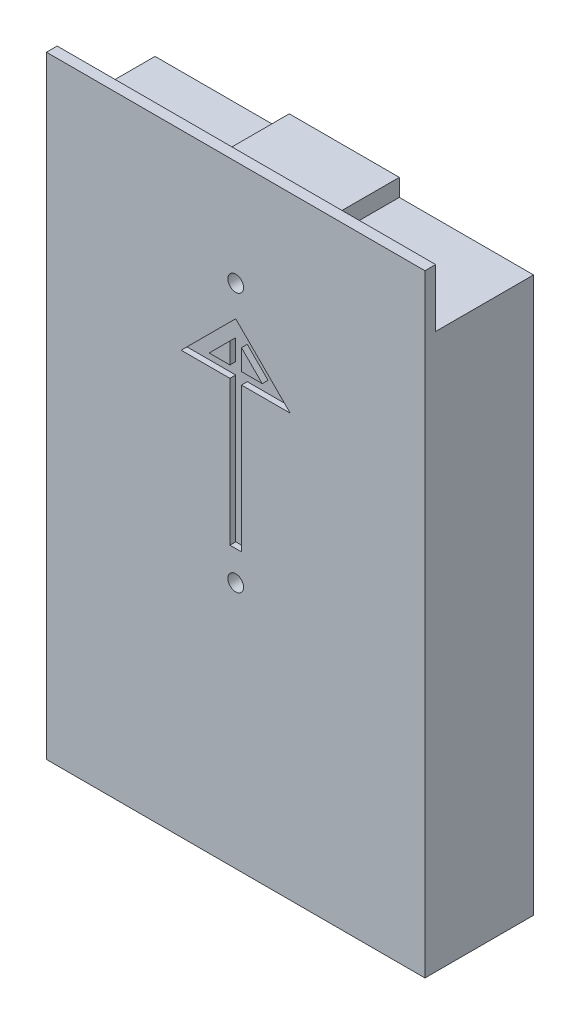
ISO-10303-21;
HEADER;
FILE_DESCRIPTION(('STEP AP214'),'2;1');
FILE_NAME('part.step','',(''),(''),'','','');
FILE_SCHEMA(('AUTOMOTIVE_DESIGN { 1 0 10303 214 1 1 1 1 }'));
ENDSEC;
DATA;
#1=APPLICATION_CONTEXT('core data for automotive mechanical design processes');
#2=APPLICATION_PROTOCOL_DEFINITION('international standard','automotive_design',2000,#1);
#3=PRODUCT_CONTEXT('',#1,'mechanical');
#4=PRODUCT('Part','Part','',(#3));
#5=PRODUCT_RELATED_PRODUCT_CATEGORY('part','',(#4));
#6=PRODUCT_DEFINITION_FORMATION('','',#4);
#7=PRODUCT_DEFINITION_CONTEXT('part definition',#1,'design');
#8=PRODUCT_DEFINITION('design','',#6,#7);
#9=PRODUCT_DEFINITION_SHAPE('','',#8);
#10=(LENGTH_UNIT() NAMED_UNIT(*) SI_UNIT(.MILLI.,.METRE.));
#11=(NAMED_UNIT(*) PLANE_ANGLE_UNIT() SI_UNIT($,.RADIAN.));
#12=(NAMED_UNIT(*) SI_UNIT($,.STERADIAN.) SOLID_ANGLE_UNIT());
#13=UNCERTAINTY_MEASURE_WITH_UNIT(LENGTH_MEASURE(1.E-05),#10,'distance_accuracy_value','');
#14=(GEOMETRIC_REPRESENTATION_CONTEXT(3) GLOBAL_UNCERTAINTY_ASSIGNED_CONTEXT((#13)) GLOBAL_UNIT_ASSIGNED_CONTEXT((#10,
#11,#12)) REPRESENTATION_CONTEXT('',''));
#15=CARTESIAN_POINT('',(0.,0.,0.));
#16=DIRECTION('',(0.,0.,1.));
#17=DIRECTION('',(1.,0.,0.));
#18=AXIS2_PLACEMENT_3D('',#15,#16,#17);
#19=CARTESIAN_POINT('',(-32.675,47.875,18.75));
#20=DIRECTION('',(0.,-1.,0.));
#21=DIRECTION('',(0.,0.,-1.));
#22=AXIS2_PLACEMENT_3D('',#19,#20,#21);
#23=PLANE('',#22);
#24=DIRECTION('',(-1.,0.,0.));
#25=VECTOR('',#24,1.);
#26=CARTESIAN_POINT('',(0.,47.875,16.9));
#27=LINE('',#26,#25);
#28=CARTESIAN_POINT('',(-9.49999999999997,47.875,16.9));
#29=VERTEX_POINT('',#28);
#30=CARTESIAN_POINT('',(-32.675,47.875,16.9));
#31=VERTEX_POINT('',#30);
#32=EDGE_CURVE('E212',#29,#31,#27,.T.);
#33=ORIENTED_EDGE('',*,*,#32,.F.);
#34=DIRECTION('',(0.,0.,1.));
#35=VECTOR('',#34,1.);
#36=CARTESIAN_POINT('',(-9.49999999999998,47.875,-19.2353840616713));
#37=LINE('',#36,#35);
#38=CARTESIAN_POINT('',(-9.49999999999998,47.875,0.));
#39=VERTEX_POINT('',#38);
#40=EDGE_CURVE('E256',#39,#29,#37,.T.);
#41=ORIENTED_EDGE('',*,*,#40,.F.);
#42=DIRECTION('',(-1.,0.,0.));
#43=VECTOR('',#42,1.);
#44=CARTESIAN_POINT('',(-32.675,47.875,0.));
#45=LINE('',#44,#43);
#46=CARTESIAN_POINT('',(-32.675,47.875,0.));
#47=VERTEX_POINT('',#46);
#48=EDGE_CURVE('E371',#39,#47,#45,.T.);
#49=ORIENTED_EDGE('',*,*,#48,.T.);
#50=DIRECTION('',(0.,0.,-1.));
#51=VECTOR('',#50,1.);
#52=CARTESIAN_POINT('',(-32.675,47.875,18.75));
#53=LINE('',#52,#51);
#54=EDGE_CURVE('E60',#31,#47,#53,.T.);
#55=ORIENTED_EDGE('',*,*,#54,.F.);
#56=EDGE_LOOP('',(#33,#41,#49,#55));
#57=FACE_BOUND('',#56,.T.);
#58=ADVANCED_FACE('F52',(#57),#23,.F.);
#59=DIRECTION('',(-1.,0.,0.));
#60=VECTOR('',#59,1.);
#61=CARTESIAN_POINT('',(0.,47.875,16.9));
#62=LINE('',#61,#60);
#63=CARTESIAN_POINT('',(32.675,47.875,16.9));
#64=VERTEX_POINT('',#63);
#65=CARTESIAN_POINT('',(9.50000000000002,47.875,16.9));
#66=VERTEX_POINT('',#65);
#67=EDGE_CURVE('E241',#64,#66,#62,.T.);
#68=ORIENTED_EDGE('',*,*,#67,.F.);
#69=DIRECTION('',(0.,0.,-1.));
#70=VECTOR('',#69,1.);
#71=CARTESIAN_POINT('',(32.675,47.875,18.75));
#72=LINE('',#71,#70);
#73=CARTESIAN_POINT('',(32.675,47.875,0.));
#74=VERTEX_POINT('',#73);
#75=EDGE_CURVE('E12',#64,#74,#72,.T.);
#76=ORIENTED_EDGE('',*,*,#75,.T.);
#77=CARTESIAN_POINT('',(9.50000000000002,47.875,0.));
#78=VERTEX_POINT('',#77);
#79=EDGE_CURVE('E372',#74,#78,#45,.T.);
#80=ORIENTED_EDGE('',*,*,#79,.T.);
#81=DIRECTION('',(0.,0.,1.));
#82=VECTOR('',#81,1.);
#83=CARTESIAN_POINT('',(9.50000000000002,47.875,-19.2353840616713));
#84=LINE('',#83,#82);
#85=EDGE_CURVE('E253',#78,#66,#84,.T.);
#86=ORIENTED_EDGE('',*,*,#85,.T.);
#87=EDGE_LOOP('',(#68,#76,#80,#86));
#88=FACE_BOUND('',#87,.T.);
#89=ADVANCED_FACE('F430',(#88),#23,.F.);
#90=CARTESIAN_POINT('',(-9.49999999999998,50.875,-19.2353840616713));
#91=DIRECTION('',(0.,1.,0.));
#92=DIRECTION('',(-1.,0.,0.));
#93=AXIS2_PLACEMENT_3D('',#90,#91,#92);
#94=PLANE('',#93);
#95=DIRECTION('',(0.,0.,1.));
#96=VECTOR('',#95,1.);
#97=CARTESIAN_POINT('',(-9.49999999999998,50.875,-19.2353840616713));
#98=LINE('',#97,#96);
#99=CARTESIAN_POINT('',(-9.49999999999998,50.875,0.));
#100=VERTEX_POINT('',#99);
#101=CARTESIAN_POINT('',(-9.49999999999998,50.875,16.9));
#102=VERTEX_POINT('',#101);
#103=EDGE_CURVE('E248',#100,#102,#98,.T.);
#104=ORIENTED_EDGE('',*,*,#103,.T.);
#105=DIRECTION('',(-1.,0.,0.));
#106=VECTOR('',#105,1.);
#107=CARTESIAN_POINT('',(0.,50.875,16.9));
#108=LINE('',#107,#106);
#109=CARTESIAN_POINT('',(9.50000000000002,50.875,16.9));
#110=VERTEX_POINT('',#109);
#111=EDGE_CURVE('E237',#110,#102,#108,.T.);
#112=ORIENTED_EDGE('',*,*,#111,.F.);
#113=DIRECTION('',(0.,0.,1.));
#114=VECTOR('',#113,1.);
#115=CARTESIAN_POINT('',(9.50000000000002,50.875,-19.2353840616713));
#116=LINE('',#115,#114);
#117=CARTESIAN_POINT('',(9.50000000000002,50.875,0.));
#118=VERTEX_POINT('',#117);
#119=EDGE_CURVE('E252',#118,#110,#116,.T.);
#120=ORIENTED_EDGE('',*,*,#119,.F.);
#121=DIRECTION('',(-1.,0.,0.));
#122=VECTOR('',#121,1.);
#123=CARTESIAN_POINT('',(-9.49999999999998,50.875,0.));
#124=LINE('',#123,#122);
#125=EDGE_CURVE('E244',#118,#100,#124,.T.);
#126=ORIENTED_EDGE('',*,*,#125,.T.);
#127=EDGE_LOOP('',(#104,#112,#120,#126));
#128=FACE_BOUND('',#127,.T.);
#129=ADVANCED_FACE('F434',(#128),#94,.T.);
#130=CARTESIAN_POINT('',(-9.49999999999998,50.875,-19.2353840616713));
#131=DIRECTION('',(-1.,0.,0.));
#132=DIRECTION('',(0.,-1.,0.));
#133=AXIS2_PLACEMENT_3D('',#130,#131,#132);
#134=PLANE('',#133);
#135=ORIENTED_EDGE('',*,*,#40,.T.);
#136=DIRECTION('',(0.,-1.,0.));
#137=VECTOR('',#136,1.);
#138=CARTESIAN_POINT('',(-9.49999999999995,0.,16.9));
#139=LINE('',#138,#137);
#140=EDGE_CURVE('E235',#102,#29,#139,.T.);
#141=ORIENTED_EDGE('',*,*,#140,.F.);
#142=ORIENTED_EDGE('',*,*,#103,.F.);
#143=DIRECTION('',(0.,-1.,0.));
#144=VECTOR('',#143,1.);
#145=CARTESIAN_POINT('',(-9.49999999999998,50.875,0.));
#146=LINE('',#145,#144);
#147=EDGE_CURVE('E254',#100,#39,#146,.T.);
#148=ORIENTED_EDGE('',*,*,#147,.T.);
#149=EDGE_LOOP('',(#135,#141,#142,#148));
#150=FACE_BOUND('',#149,.T.);
#151=ADVANCED_FACE('F482',(#150),#134,.T.);
#152=CARTESIAN_POINT('',(9.50000000000002,50.875,-19.2353840616713));
#153=DIRECTION('',(1.,0.,0.));
#154=DIRECTION('',(0.,0.,-1.));
#155=AXIS2_PLACEMENT_3D('',#152,#153,#154);
#156=PLANE('',#155);
#157=ORIENTED_EDGE('',*,*,#119,.T.);
#158=DIRECTION('',(0.,1.,0.));
#159=VECTOR('',#158,1.);
#160=CARTESIAN_POINT('',(9.50000000000002,0.,16.9));
#161=LINE('',#160,#159);
#162=EDGE_CURVE('E239',#66,#110,#161,.T.);
#163=ORIENTED_EDGE('',*,*,#162,.F.);
#164=ORIENTED_EDGE('',*,*,#85,.F.);
#165=DIRECTION('',(0.,1.,0.));
#166=VECTOR('',#165,1.);
#167=CARTESIAN_POINT('',(9.50000000000002,50.875,0.));
#168=LINE('',#167,#166);
#169=EDGE_CURVE('E249',#78,#118,#168,.T.);
#170=ORIENTED_EDGE('',*,*,#169,.T.);
#171=EDGE_LOOP('',(#157,#163,#164,#170));
#172=FACE_BOUND('',#171,.T.);
#173=ADVANCED_FACE('F492',(#172),#156,.T.);
#174=CARTESIAN_POINT('',(32.675,-47.875,18.75));
#175=DIRECTION('',(-1.,0.,0.));
#176=DIRECTION('',(0.,0.,1.));
#177=AXIS2_PLACEMENT_3D('',#174,#175,#176);
#178=PLANE('',#177);
#179=DIRECTION('',(0.,1.,0.));
#180=VECTOR('',#179,1.);
#181=CARTESIAN_POINT('',(32.675,-47.875,0.));
#182=LINE('',#181,#180);
#183=CARTESIAN_POINT('',(32.675,-47.875,0.));
#184=VERTEX_POINT('',#183);
#185=EDGE_CURVE('E353',#184,#74,#182,.T.);
#186=ORIENTED_EDGE('',*,*,#185,.T.);
#187=ORIENTED_EDGE('',*,*,#75,.F.);
#188=DIRECTION('',(0.,1.,0.));
#189=VECTOR('',#188,1.);
#190=CARTESIAN_POINT('',(32.675,0.,16.9));
#191=LINE('',#190,#189);
#192=CARTESIAN_POINT('',(32.675,57.875,16.9));
#193=VERTEX_POINT('',#192);
#194=EDGE_CURVE('E225',#64,#193,#191,.T.);
#195=ORIENTED_EDGE('',*,*,#194,.T.);
#196=DIRECTION('',(0.,0.,1.));
#197=VECTOR('',#196,1.);
#198=CARTESIAN_POINT('',(32.675,57.875,16.9));
#199=LINE('',#198,#197);
#200=CARTESIAN_POINT('',(32.675,57.875,18.75));
#201=VERTEX_POINT('',#200);
#202=EDGE_CURVE('E224',#193,#201,#199,.T.);
#203=ORIENTED_EDGE('',*,*,#202,.T.);
#204=DIRECTION('',(0.,1.,0.));
#205=VECTOR('',#204,1.);
#206=CARTESIAN_POINT('',(32.675,-47.875,18.75));
#207=LINE('',#206,#205);
#208=CARTESIAN_POINT('',(32.675,-47.875,18.75));
#209=VERTEX_POINT('',#208);
#210=EDGE_CURVE('E362',#209,#201,#207,.T.);
#211=ORIENTED_EDGE('',*,*,#210,.F.);
#212=DIRECTION('',(0.,0.,-1.));
#213=VECTOR('',#212,1.);
#214=CARTESIAN_POINT('',(32.675,-47.875,18.75));
#215=LINE('',#214,#213);
#216=EDGE_CURVE('E368',#209,#184,#215,.T.);
#217=ORIENTED_EDGE('',*,*,#216,.T.);
#218=EDGE_LOOP('',(#186,#187,#195,#203,#211,#217));
#219=FACE_BOUND('',#218,.T.);
#220=ADVANCED_FACE('F54',(#219),#178,.F.);
#221=CARTESIAN_POINT('',(-32.675,-47.875,18.75));
#222=DIRECTION('',(1.,0.,0.));
#223=DIRECTION('',(0.,0.,-1.));
#224=AXIS2_PLACEMENT_3D('',#221,#222,#223);
#225=PLANE('',#224);
#226=DIRECTION('',(0.,-1.,0.));
#227=VECTOR('',#226,1.);
#228=CARTESIAN_POINT('',(-32.675,-47.875,0.));
#229=LINE('',#228,#227);
#230=CARTESIAN_POINT('',(-32.675,-47.875,0.));
#231=VERTEX_POINT('',#230);
#232=EDGE_CURVE('E375',#47,#231,#229,.T.);
#233=ORIENTED_EDGE('',*,*,#232,.T.);
#234=DIRECTION('',(0.,0.,-1.));
#235=VECTOR('',#234,1.);
#236=CARTESIAN_POINT('',(-32.675,-47.875,18.75));
#237=LINE('',#236,#235);
#238=CARTESIAN_POINT('',(-32.675,-47.875,18.75));
#239=VERTEX_POINT('',#238);
#240=EDGE_CURVE('E380',#239,#231,#237,.T.);
#241=ORIENTED_EDGE('',*,*,#240,.F.);
#242=DIRECTION('',(0.,-1.,0.));
#243=VECTOR('',#242,1.);
#244=CARTESIAN_POINT('',(-32.675,-47.875,18.75));
#245=LINE('',#244,#243);
#246=CARTESIAN_POINT('',(-32.675,57.875,18.75));
#247=VERTEX_POINT('',#246);
#248=EDGE_CURVE('E220',#247,#239,#245,.T.);
#249=ORIENTED_EDGE('',*,*,#248,.F.);
#250=DIRECTION('',(0.,0.,1.));
#251=VECTOR('',#250,1.);
#252=CARTESIAN_POINT('',(-32.675,57.875,16.9));
#253=LINE('',#252,#251);
#254=CARTESIAN_POINT('',(-32.675,57.875,16.9));
#255=VERTEX_POINT('',#254);
#256=EDGE_CURVE('E217',#255,#247,#253,.T.);
#257=ORIENTED_EDGE('',*,*,#256,.F.);
#258=DIRECTION('',(0.,1.,0.));
#259=VECTOR('',#258,1.);
#260=CARTESIAN_POINT('',(-32.675,0.,16.9));
#261=LINE('',#260,#259);
#262=EDGE_CURVE('E205',#31,#255,#261,.T.);
#263=ORIENTED_EDGE('',*,*,#262,.F.);
#264=ORIENTED_EDGE('',*,*,#54,.T.);
#265=EDGE_LOOP('',(#233,#241,#249,#257,#263,#264));
#266=FACE_BOUND('',#265,.T.);
#267=ADVANCED_FACE('F218',(#266),#225,.F.);
#268=CARTESIAN_POINT('',(-32.675,-47.875,18.75));
#269=DIRECTION('',(0.,1.,0.));
#270=DIRECTION('',(0.,0.,1.));
#271=AXIS2_PLACEMENT_3D('',#268,#269,#270);
#272=PLANE('',#271);
#273=DIRECTION('',(1.,0.,0.));
#274=VECTOR('',#273,1.);
#275=CARTESIAN_POINT('',(-32.675,-47.875,0.));
#276=LINE('',#275,#274);
#277=EDGE_CURVE('E364',#231,#184,#276,.T.);
#278=ORIENTED_EDGE('',*,*,#277,.T.);
#279=ORIENTED_EDGE('',*,*,#216,.F.);
#280=DIRECTION('',(1.,0.,0.));
#281=VECTOR('',#280,1.);
#282=CARTESIAN_POINT('',(-32.675,-47.875,18.75));
#283=LINE('',#282,#281);
#284=EDGE_CURVE('E366',#239,#209,#283,.T.);
#285=ORIENTED_EDGE('',*,*,#284,.F.);
#286=ORIENTED_EDGE('',*,*,#240,.T.);
#287=EDGE_LOOP('',(#278,#279,#285,#286));
#288=FACE_BOUND('',#287,.T.);
#289=ADVANCED_FACE('F394',(#288),#272,.F.);
#290=CARTESIAN_POINT('',(0.,0.,18.75));
#291=DIRECTION('',(0.,0.,-1.));
#292=DIRECTION('',(-1.,0.,0.));
#293=AXIS2_PLACEMENT_3D('',#290,#291,#292);
#294=PLANE('',#293);
#295=DIRECTION('',(1.,0.,0.));
#296=VECTOR('',#295,1.);
#297=CARTESIAN_POINT('',(0.,57.875,18.75));
#298=LINE('',#297,#296);
#299=EDGE_CURVE('E230',#247,#201,#298,.T.);
#300=ORIENTED_EDGE('',*,*,#299,.F.);
#301=ORIENTED_EDGE('',*,*,#248,.T.);
#302=ORIENTED_EDGE('',*,*,#284,.T.);
#303=ORIENTED_EDGE('',*,*,#210,.T.);
#304=EDGE_LOOP('',(#300,#301,#302,#303));
#305=FACE_BOUND('',#304,.T.);
#306=DIRECTION('',(-0.707106781186541,-0.707106781186554,0.));
#307=VECTOR('',#306,1.);
#308=CARTESIAN_POINT('',(-17.1805700218029,17.1805700218026,18.75));
#309=LINE('',#308,#307);
#310=CARTESIAN_POINT('',(0.,34.3611400436058,18.75));
#311=VERTEX_POINT('',#310);
#312=CARTESIAN_POINT('',(-9.4140995918421,24.9470404517635,18.75));
#313=VERTEX_POINT('',#312);
#314=EDGE_CURVE('E75',#311,#313,#309,.T.);
#315=ORIENTED_EDGE('',*,*,#314,.F.);
#316=DIRECTION('',(-0.707106781186554,0.707106781186541,0.));
#317=VECTOR('',#316,1.);
#318=CARTESIAN_POINT('',(17.1805700218029,17.1805700218032,18.75));
#319=LINE('',#318,#317);
#320=CARTESIAN_POINT('',(9.4140995918424,24.9470404517635,18.75));
#321=VERTEX_POINT('',#320);
#322=EDGE_CURVE('E313',#321,#311,#319,.T.);
#323=ORIENTED_EDGE('',*,*,#322,.F.);
#324=DIRECTION('',(1.,0.,0.));
#325=VECTOR('',#324,1.);
#326=CARTESIAN_POINT('',(0.,24.9470404517635,18.75));
#327=LINE('',#326,#325);
#328=CARTESIAN_POINT('',(1.,24.9470404517635,18.75));
#329=VERTEX_POINT('',#328);
#330=EDGE_CURVE('E330',#329,#321,#327,.T.);
#331=ORIENTED_EDGE('',*,*,#330,.F.);
#332=DIRECTION('',(0.,1.,0.));
#333=VECTOR('',#332,1.);
#334=CARTESIAN_POINT('',(1.,32.9469264812327,18.75));
#335=LINE('',#334,#333);
#336=CARTESIAN_POINT('',(1.,0.,18.75));
#337=VERTEX_POINT('',#336);
#338=EDGE_CURVE('E282',#329,#337,#335,.F.);
#339=ORIENTED_EDGE('',*,*,#338,.T.);
#340=DIRECTION('',(-1.,0.,0.));
#341=VECTOR('',#340,1.);
#342=CARTESIAN_POINT('',(1.,0.,18.75));
#343=LINE('',#342,#341);
#344=CARTESIAN_POINT('',(-1.,0.,18.75));
#345=VERTEX_POINT('',#344);
#346=EDGE_CURVE('E279',#337,#345,#343,.T.);
#347=ORIENTED_EDGE('',*,*,#346,.T.);
#348=DIRECTION('',(0.,1.,0.));
#349=VECTOR('',#348,1.);
#350=CARTESIAN_POINT('',(-1.,32.9469264812327,18.75));
#351=LINE('',#350,#349);
#352=CARTESIAN_POINT('',(-1.,24.9470404517635,18.75));
#353=VERTEX_POINT('',#352);
#354=EDGE_CURVE('E276',#353,#345,#351,.F.);
#355=ORIENTED_EDGE('',*,*,#354,.F.);
#356=EDGE_CURVE('E319',#313,#353,#327,.T.);
#357=ORIENTED_EDGE('',*,*,#356,.F.);
#358=EDGE_LOOP('',(#315,#323,#331,#339,#347,#355,#357));
#359=FACE_BOUND('',#358,.T.);
#360=CARTESIAN_POINT('',(0.,39.675,18.75));
#361=DIRECTION('',(0.,0.,1.));
#362=DIRECTION('',(1.,0.,0.));
#363=AXIS2_PLACEMENT_3D('',#360,#361,#362);
#364=CIRCLE('',#363,1.36);
#365=CARTESIAN_POINT('',(1.36,39.675,18.75));
#366=VERTEX_POINT('',#365);
#367=EDGE_CURVE('E354',#366,#366,#364,.T.);
#368=ORIENTED_EDGE('',*,*,#367,.F.);
#369=EDGE_LOOP('',(#368));
#370=FACE_BOUND('',#369,.T.);
#371=CARTESIAN_POINT('',(0.,-5.12499999999999,18.75));
#372=DIRECTION('',(0.,0.,1.));
#373=DIRECTION('',(1.,0.,0.));
#374=AXIS2_PLACEMENT_3D('',#371,#372,#373);
#375=CIRCLE('',#374,1.36);
#376=CARTESIAN_POINT('',(1.36000000000001,-5.12499999999999,18.75));
#377=VERTEX_POINT('',#376);
#378=EDGE_CURVE('E349',#377,#377,#375,.T.);
#379=ORIENTED_EDGE('',*,*,#378,.F.);
#380=EDGE_LOOP('',(#379));
#381=FACE_BOUND('',#380,.T.);
#382=ADVANCED_FACE('F400',(#305,#359,#370,#381),#294,.F.);
#383=CARTESIAN_POINT('',(0.,0.,0.));
#384=DIRECTION('',(0.,0.,-1.));
#385=DIRECTION('',(-1.,0.,0.));
#386=AXIS2_PLACEMENT_3D('',#383,#384,#385);
#387=PLANE('',#386);
#388=CARTESIAN_POINT('',(0.,39.675,0.));
#389=DIRECTION('',(0.,0.,1.));
#390=DIRECTION('',(1.,0.,0.));
#391=AXIS2_PLACEMENT_3D('',#388,#389,#390);
#392=CIRCLE('',#391,1.36);
#393=CARTESIAN_POINT('',(1.36,39.675,0.));
#394=VERTEX_POINT('',#393);
#395=EDGE_CURVE('E350',#394,#394,#392,.T.);
#396=ORIENTED_EDGE('',*,*,#395,.T.);
#397=EDGE_LOOP('',(#396));
#398=FACE_BOUND('',#397,.T.);
#399=CARTESIAN_POINT('',(0.,-5.12499999999999,0.));
#400=DIRECTION('',(0.,0.,1.));
#401=DIRECTION('',(1.,0.,0.));
#402=AXIS2_PLACEMENT_3D('',#399,#400,#401);
#403=CIRCLE('',#402,1.36);
#404=CARTESIAN_POINT('',(1.36000000000001,-5.12499999999999,0.));
#405=VERTEX_POINT('',#404);
#406=EDGE_CURVE('E357',#405,#405,#403,.T.);
#407=ORIENTED_EDGE('',*,*,#406,.T.);
#408=EDGE_LOOP('',(#407));
#409=FACE_BOUND('',#408,.T.);
#410=ORIENTED_EDGE('',*,*,#185,.F.);
#411=ORIENTED_EDGE('',*,*,#277,.F.);
#412=ORIENTED_EDGE('',*,*,#232,.F.);
#413=ORIENTED_EDGE('',*,*,#48,.F.);
#414=ORIENTED_EDGE('',*,*,#147,.F.);
#415=ORIENTED_EDGE('',*,*,#125,.F.);
#416=ORIENTED_EDGE('',*,*,#169,.F.);
#417=ORIENTED_EDGE('',*,*,#79,.F.);
#418=EDGE_LOOP('',(#410,#411,#412,#413,#414,#415,#416,#417));
#419=FACE_BOUND('',#418,.T.);
#420=ADVANCED_FACE('F390',(#398,#409,#419),#387,.T.);
#421=CARTESIAN_POINT('',(0.,-5.12499999999999,0.));
#422=DIRECTION('',(0.,0.,1.));
#423=DIRECTION('',(1.,0.,0.));
#424=AXIS2_PLACEMENT_3D('',#421,#422,#423);
#425=CYLINDRICAL_SURFACE('',#424,1.36);
#426=ORIENTED_EDGE('',*,*,#406,.F.);
#427=EDGE_LOOP('',(#426));
#428=FACE_BOUND('',#427,.T.);
#429=ORIENTED_EDGE('',*,*,#378,.T.);
#430=EDGE_LOOP('',(#429));
#431=FACE_BOUND('',#430,.T.);
#432=ADVANCED_FACE('F413',(#428,#431),#425,.F.);
#433=CARTESIAN_POINT('',(0.,39.675,0.));
#434=DIRECTION('',(0.,0.,1.));
#435=DIRECTION('',(1.,0.,0.));
#436=AXIS2_PLACEMENT_3D('',#433,#434,#435);
#437=CYLINDRICAL_SURFACE('',#436,1.36);
#438=ORIENTED_EDGE('',*,*,#395,.F.);
#439=EDGE_LOOP('',(#438));
#440=FACE_BOUND('',#439,.T.);
#441=ORIENTED_EDGE('',*,*,#367,.T.);
#442=EDGE_LOOP('',(#441));
#443=FACE_BOUND('',#442,.T.);
#444=ADVANCED_FACE('F415',(#440,#443),#437,.F.);
#445=CARTESIAN_POINT('',(0.,0.,17.75));
#446=DIRECTION('',(0.,0.,1.));
#447=DIRECTION('',(1.,0.,0.));
#448=AXIS2_PLACEMENT_3D('',#445,#446,#447);
#449=PLANE('',#448);
#450=DIRECTION('',(0.,1.,0.));
#451=VECTOR('',#450,1.);
#452=CARTESIAN_POINT('',(-1.,32.9469264812327,17.75));
#453=LINE('',#452,#451);
#454=CARTESIAN_POINT('',(-1.,24.9470404517635,17.75));
#455=VERTEX_POINT('',#454);
#456=CARTESIAN_POINT('',(-1.,0.,17.75));
#457=VERTEX_POINT('',#456);
#458=EDGE_CURVE('E266',#455,#457,#453,.F.);
#459=ORIENTED_EDGE('',*,*,#458,.T.);
#460=DIRECTION('',(-1.,0.,0.));
#461=VECTOR('',#460,1.);
#462=CARTESIAN_POINT('',(1.,0.,17.75));
#463=LINE('',#462,#461);
#464=CARTESIAN_POINT('',(1.,0.,17.75));
#465=VERTEX_POINT('',#464);
#466=EDGE_CURVE('E270',#465,#457,#463,.T.);
#467=ORIENTED_EDGE('',*,*,#466,.F.);
#468=DIRECTION('',(0.,1.,0.));
#469=VECTOR('',#468,1.);
#470=CARTESIAN_POINT('',(1.,32.9469264812327,17.75));
#471=LINE('',#470,#469);
#472=CARTESIAN_POINT('',(1.,24.9470404517635,17.75));
#473=VERTEX_POINT('',#472);
#474=EDGE_CURVE('E273',#473,#465,#471,.F.);
#475=ORIENTED_EDGE('',*,*,#474,.F.);
#476=DIRECTION('',(1.,0.,0.));
#477=VECTOR('',#476,1.);
#478=CARTESIAN_POINT('',(0.,24.9470404517635,17.75));
#479=LINE('',#478,#477);
#480=CARTESIAN_POINT('',(9.4140995918424,24.9470404517635,17.75));
#481=VERTEX_POINT('',#480);
#482=EDGE_CURVE('E322',#473,#481,#479,.T.);
#483=ORIENTED_EDGE('',*,*,#482,.T.);
#484=DIRECTION('',(-0.707106781186554,0.707106781186541,0.));
#485=VECTOR('',#484,1.);
#486=CARTESIAN_POINT('',(17.1805700218029,17.1805700218032,17.75));
#487=LINE('',#486,#485);
#488=CARTESIAN_POINT('',(0.,34.3611400436058,17.75));
#489=VERTEX_POINT('',#488);
#490=EDGE_CURVE('E315',#481,#489,#487,.T.);
#491=ORIENTED_EDGE('',*,*,#490,.T.);
#492=DIRECTION('',(-0.707106781186541,-0.707106781186554,0.));
#493=VECTOR('',#492,1.);
#494=CARTESIAN_POINT('',(-17.1805700218029,17.1805700218026,17.75));
#495=LINE('',#494,#493);
#496=CARTESIAN_POINT('',(-9.4140995918421,24.9470404517635,17.75));
#497=VERTEX_POINT('',#496);
#498=EDGE_CURVE('E318',#489,#497,#495,.T.);
#499=ORIENTED_EDGE('',*,*,#498,.T.);
#500=EDGE_CURVE('E323',#497,#455,#479,.T.);
#501=ORIENTED_EDGE('',*,*,#500,.T.);
#502=EDGE_LOOP('',(#459,#467,#475,#483,#491,#499,#501));
#503=FACE_BOUND('',#502,.T.);
#504=CARTESIAN_POINT('',(-1.,30.5327129188595,17.75));
#505=VERTEX_POINT('',#504);
#506=CARTESIAN_POINT('',(-1.,26.9470404517635,17.75));
#507=VERTEX_POINT('',#506);
#508=EDGE_CURVE('E268',#505,#507,#453,.F.);
#509=ORIENTED_EDGE('',*,*,#508,.T.);
#510=DIRECTION('',(1.,0.,0.));
#511=VECTOR('',#510,1.);
#512=CARTESIAN_POINT('',(0.,26.9470404517635,17.75));
#513=LINE('',#512,#511);
#514=CARTESIAN_POINT('',(-4.58567246709596,26.9470404517635,17.75));
#515=VERTEX_POINT('',#514);
#516=EDGE_CURVE('E298',#515,#507,#513,.T.);
#517=ORIENTED_EDGE('',*,*,#516,.F.);
#518=DIRECTION('',(-0.707106781186541,-0.707106781186554,0.));
#519=VECTOR('',#518,1.);
#520=CARTESIAN_POINT('',(-15.7663564594298,15.7663564594295,17.75));
#521=LINE('',#520,#519);
#522=EDGE_CURVE('E294',#505,#515,#521,.T.);
#523=ORIENTED_EDGE('',*,*,#522,.F.);
#524=EDGE_LOOP('',(#509,#517,#523));
#525=FACE_BOUND('',#524,.T.);
#526=DIRECTION('',(-0.707106781186554,0.707106781186541,0.));
#527=VECTOR('',#526,1.);
#528=CARTESIAN_POINT('',(15.7663564594298,15.7663564594301,17.75));
#529=LINE('',#528,#527);
#530=CARTESIAN_POINT('',(4.58567246709614,26.9470404517635,17.75));
#531=VERTEX_POINT('',#530);
#532=CARTESIAN_POINT('',(0.999999999999999,30.5327129188596,17.75));
#533=VERTEX_POINT('',#532);
#534=EDGE_CURVE('E291',#531,#533,#529,.T.);
#535=ORIENTED_EDGE('',*,*,#534,.F.);
#536=CARTESIAN_POINT('',(1.,26.9470404517635,17.75));
#537=VERTEX_POINT('',#536);
#538=EDGE_CURVE('E297',#537,#531,#513,.T.);
#539=ORIENTED_EDGE('',*,*,#538,.F.);
#540=EDGE_CURVE('E275',#533,#537,#471,.F.);
#541=ORIENTED_EDGE('',*,*,#540,.F.);
#542=EDGE_LOOP('',(#535,#539,#541));
#543=FACE_BOUND('',#542,.T.);
#544=ADVANCED_FACE('F422',(#503,#525,#543),#449,.T.);
#545=CARTESIAN_POINT('',(1.,32.9469264812327,17.75));
#546=DIRECTION('',(-1.,0.,0.));
#547=DIRECTION('',(0.,0.,1.));
#548=AXIS2_PLACEMENT_3D('',#545,#546,#547);
#549=PLANE('',#548);
#550=DIRECTION('',(0.,0.,-1.));
#551=VECTOR('',#550,1.);
#552=CARTESIAN_POINT('',(1.,30.5327129188596,17.75));
#553=LINE('',#552,#551);
#554=CARTESIAN_POINT('',(0.999999999999999,30.5327129188596,18.75));
#555=VERTEX_POINT('',#554);
#556=EDGE_CURVE('E343',#555,#533,#553,.T.);
#557=ORIENTED_EDGE('',*,*,#556,.T.);
#558=ORIENTED_EDGE('',*,*,#540,.T.);
#559=DIRECTION('',(0.,0.,1.));
#560=VECTOR('',#559,1.);
#561=CARTESIAN_POINT('',(1.,26.9470404517635,17.75));
#562=LINE('',#561,#560);
#563=CARTESIAN_POINT('',(1.,26.9470404517635,18.75));
#564=VERTEX_POINT('',#563);
#565=EDGE_CURVE('E287',#537,#564,#562,.T.);
#566=ORIENTED_EDGE('',*,*,#565,.T.);
#567=EDGE_CURVE('E269',#555,#564,#335,.F.);
#568=ORIENTED_EDGE('',*,*,#567,.F.);
#569=EDGE_LOOP('',(#557,#558,#566,#568));
#570=FACE_BOUND('',#569,.T.);
#571=ADVANCED_FACE('F425',(#570),#549,.T.);
#572=CARTESIAN_POINT('',(-1.,32.9469264812327,17.75));
#573=DIRECTION('',(-1.,0.,0.));
#574=DIRECTION('',(0.,0.,1.));
#575=AXIS2_PLACEMENT_3D('',#572,#573,#574);
#576=PLANE('',#575);
#577=ORIENTED_EDGE('',*,*,#508,.F.);
#578=DIRECTION('',(0.,0.,-1.));
#579=VECTOR('',#578,1.);
#580=CARTESIAN_POINT('',(-1.,30.5327129188595,17.75));
#581=LINE('',#580,#579);
#582=CARTESIAN_POINT('',(-1.,30.5327129188595,18.75));
#583=VERTEX_POINT('',#582);
#584=EDGE_CURVE('E338',#583,#505,#581,.T.);
#585=ORIENTED_EDGE('',*,*,#584,.F.);
#586=CARTESIAN_POINT('',(-1.,26.9470404517635,18.75));
#587=VERTEX_POINT('',#586);
#588=EDGE_CURVE('E67',#583,#587,#351,.F.);
#589=ORIENTED_EDGE('',*,*,#588,.T.);
#590=DIRECTION('',(0.,0.,1.));
#591=VECTOR('',#590,1.);
#592=CARTESIAN_POINT('',(-1.,26.9470404517635,17.75));
#593=LINE('',#592,#591);
#594=EDGE_CURVE('E340',#507,#587,#593,.T.);
#595=ORIENTED_EDGE('',*,*,#594,.F.);
#596=EDGE_LOOP('',(#577,#585,#589,#595));
#597=FACE_BOUND('',#596,.T.);
#598=ADVANCED_FACE('F614',(#597),#576,.F.);
#599=ORIENTED_EDGE('',*,*,#474,.T.);
#600=DIRECTION('',(0.,0.,1.));
#601=VECTOR('',#600,1.);
#602=CARTESIAN_POINT('',(1.,0.,17.75));
#603=LINE('',#602,#601);
#604=EDGE_CURVE('E285',#465,#337,#603,.T.);
#605=ORIENTED_EDGE('',*,*,#604,.T.);
#606=ORIENTED_EDGE('',*,*,#338,.F.);
#607=DIRECTION('',(0.,0.,1.));
#608=VECTOR('',#607,1.);
#609=CARTESIAN_POINT('',(1.,24.9470404517635,17.75));
#610=LINE('',#609,#608);
#611=EDGE_CURVE('E341',#473,#329,#610,.T.);
#612=ORIENTED_EDGE('',*,*,#611,.F.);
#613=EDGE_LOOP('',(#599,#605,#606,#612));
#614=FACE_BOUND('',#613,.T.);
#615=ADVANCED_FACE('F620',(#614),#549,.T.);
#616=CARTESIAN_POINT('',(1.,0.,17.75));
#617=DIRECTION('',(0.,1.,0.));
#618=DIRECTION('',(0.,0.,1.));
#619=AXIS2_PLACEMENT_3D('',#616,#617,#618);
#620=PLANE('',#619);
#621=ORIENTED_EDGE('',*,*,#346,.F.);
#622=ORIENTED_EDGE('',*,*,#604,.F.);
#623=ORIENTED_EDGE('',*,*,#466,.T.);
#624=DIRECTION('',(0.,0.,1.));
#625=VECTOR('',#624,1.);
#626=CARTESIAN_POINT('',(-1.,0.,17.75));
#627=LINE('',#626,#625);
#628=EDGE_CURVE('E288',#457,#345,#627,.T.);
#629=ORIENTED_EDGE('',*,*,#628,.T.);
#630=EDGE_LOOP('',(#621,#622,#623,#629));
#631=FACE_BOUND('',#630,.T.);
#632=ADVANCED_FACE('F611',(#631),#620,.T.);
#633=DIRECTION('',(0.,0.,1.));
#634=VECTOR('',#633,1.);
#635=CARTESIAN_POINT('',(-1.,24.9470404517635,17.75));
#636=LINE('',#635,#634);
#637=EDGE_CURVE('E345',#455,#353,#636,.T.);
#638=ORIENTED_EDGE('',*,*,#637,.T.);
#639=ORIENTED_EDGE('',*,*,#354,.T.);
#640=ORIENTED_EDGE('',*,*,#628,.F.);
#641=ORIENTED_EDGE('',*,*,#458,.F.);
#642=EDGE_LOOP('',(#638,#639,#640,#641));
#643=FACE_BOUND('',#642,.T.);
#644=ADVANCED_FACE('F604',(#643),#576,.F.);
#645=CARTESIAN_POINT('',(-17.1805700218029,17.1805700218026,17.75));
#646=DIRECTION('',(-0.707106781186554,0.707106781186541,0.));
#647=DIRECTION('',(-0.707106781186541,-0.707106781186554,0.));
#648=AXIS2_PLACEMENT_3D('',#645,#646,#647);
#649=PLANE('',#648);
#650=ORIENTED_EDGE('',*,*,#314,.T.);
#651=DIRECTION('',(0.,0.,1.));
#652=VECTOR('',#651,1.);
#653=CARTESIAN_POINT('',(-9.4140995918421,24.9470404517635,17.75));
#654=LINE('',#653,#652);
#655=EDGE_CURVE('E335',#497,#313,#654,.T.);
#656=ORIENTED_EDGE('',*,*,#655,.F.);
#657=ORIENTED_EDGE('',*,*,#498,.F.);
#658=DIRECTION('',(0.,0.,1.));
#659=VECTOR('',#658,1.);
#660=CARTESIAN_POINT('',(0.,34.3611400436058,17.75));
#661=LINE('',#660,#659);
#662=EDGE_CURVE('E326',#489,#311,#661,.T.);
#663=ORIENTED_EDGE('',*,*,#662,.T.);
#664=EDGE_LOOP('',(#650,#656,#657,#663));
#665=FACE_BOUND('',#664,.T.);
#666=ADVANCED_FACE('F572',(#665),#649,.F.);
#667=CARTESIAN_POINT('',(17.1805700218029,17.1805700218032,17.75));
#668=DIRECTION('',(0.707106781186541,0.707106781186554,0.));
#669=DIRECTION('',(-0.707106781186554,0.707106781186541,0.));
#670=AXIS2_PLACEMENT_3D('',#667,#668,#669);
#671=PLANE('',#670);
#672=ORIENTED_EDGE('',*,*,#322,.T.);
#673=ORIENTED_EDGE('',*,*,#662,.F.);
#674=ORIENTED_EDGE('',*,*,#490,.F.);
#675=DIRECTION('',(0.,0.,1.));
#676=VECTOR('',#675,1.);
#677=CARTESIAN_POINT('',(9.4140995918424,24.9470404517635,17.75));
#678=LINE('',#677,#676);
#679=EDGE_CURVE('E278',#481,#321,#678,.T.);
#680=ORIENTED_EDGE('',*,*,#679,.T.);
#681=EDGE_LOOP('',(#672,#673,#674,#680));
#682=FACE_BOUND('',#681,.T.);
#683=ADVANCED_FACE('F556',(#682),#671,.F.);
#684=CARTESIAN_POINT('',(0.,24.9470404517635,17.75));
#685=DIRECTION('',(0.,-1.,0.));
#686=DIRECTION('',(0.,0.,-1.));
#687=AXIS2_PLACEMENT_3D('',#684,#685,#686);
#688=PLANE('',#687);
#689=ORIENTED_EDGE('',*,*,#611,.T.);
#690=ORIENTED_EDGE('',*,*,#330,.T.);
#691=ORIENTED_EDGE('',*,*,#679,.F.);
#692=ORIENTED_EDGE('',*,*,#482,.F.);
#693=EDGE_LOOP('',(#689,#690,#691,#692));
#694=FACE_BOUND('',#693,.T.);
#695=ADVANCED_FACE('F564',(#694),#688,.F.);
#696=CARTESIAN_POINT('',(-15.7663564594298,15.7663564594295,17.75));
#697=DIRECTION('',(-0.707106781186554,0.707106781186541,0.));
#698=DIRECTION('',(-0.707106781186541,-0.707106781186554,0.));
#699=AXIS2_PLACEMENT_3D('',#696,#697,#698);
#700=PLANE('',#699);
#701=ORIENTED_EDGE('',*,*,#584,.T.);
#702=ORIENTED_EDGE('',*,*,#522,.T.);
#703=DIRECTION('',(0.,0.,1.));
#704=VECTOR('',#703,1.);
#705=CARTESIAN_POINT('',(-4.58567246709596,26.9470404517635,17.75));
#706=LINE('',#705,#704);
#707=CARTESIAN_POINT('',(-4.58567246709596,26.9470404517635,18.75));
#708=VERTEX_POINT('',#707);
#709=EDGE_CURVE('E301',#515,#708,#706,.T.);
#710=ORIENTED_EDGE('',*,*,#709,.T.);
#711=DIRECTION('',(-0.707106781186541,-0.707106781186554,0.));
#712=VECTOR('',#711,1.);
#713=CARTESIAN_POINT('',(-15.7663564594298,15.7663564594295,18.75));
#714=LINE('',#713,#712);
#715=EDGE_CURVE('E304',#583,#708,#714,.T.);
#716=ORIENTED_EDGE('',*,*,#715,.F.);
#717=EDGE_LOOP('',(#701,#702,#710,#716));
#718=FACE_BOUND('',#717,.T.);
#719=ADVANCED_FACE('F546',(#718),#700,.T.);
#720=CARTESIAN_POINT('',(0.,26.9470404517635,17.75));
#721=DIRECTION('',(0.,-1.,0.));
#722=DIRECTION('',(0.,0.,-1.));
#723=AXIS2_PLACEMENT_3D('',#720,#721,#722);
#724=PLANE('',#723);
#725=ORIENTED_EDGE('',*,*,#594,.T.);
#726=DIRECTION('',(1.,0.,0.));
#727=VECTOR('',#726,1.);
#728=CARTESIAN_POINT('',(0.,26.9470404517635,18.75));
#729=LINE('',#728,#727);
#730=EDGE_CURVE('E295',#708,#587,#729,.T.);
#731=ORIENTED_EDGE('',*,*,#730,.F.);
#732=ORIENTED_EDGE('',*,*,#709,.F.);
#733=ORIENTED_EDGE('',*,*,#516,.T.);
#734=EDGE_LOOP('',(#725,#731,#732,#733));
#735=FACE_BOUND('',#734,.T.);
#736=ADVANCED_FACE('F555',(#735),#724,.T.);
#737=ORIENTED_EDGE('',*,*,#500,.F.);
#738=ORIENTED_EDGE('',*,*,#655,.T.);
#739=ORIENTED_EDGE('',*,*,#356,.T.);
#740=ORIENTED_EDGE('',*,*,#637,.F.);
#741=EDGE_LOOP('',(#737,#738,#739,#740));
#742=FACE_BOUND('',#741,.T.);
#743=ADVANCED_FACE('F561',(#742),#688,.F.);
#744=CARTESIAN_POINT('',(15.7663564594298,15.7663564594301,17.75));
#745=DIRECTION('',(0.707106781186541,0.707106781186554,0.));
#746=DIRECTION('',(-0.707106781186554,0.707106781186541,0.));
#747=AXIS2_PLACEMENT_3D('',#744,#745,#746);
#748=PLANE('',#747);
#749=DIRECTION('',(-0.707106781186554,0.707106781186541,0.));
#750=VECTOR('',#749,1.);
#751=CARTESIAN_POINT('',(15.7663564594298,15.7663564594301,18.75));
#752=LINE('',#751,#750);
#753=CARTESIAN_POINT('',(4.58567246709614,26.9470404517635,18.75));
#754=VERTEX_POINT('',#753);
#755=EDGE_CURVE('E265',#754,#555,#752,.T.);
#756=ORIENTED_EDGE('',*,*,#755,.F.);
#757=DIRECTION('',(0.,0.,1.));
#758=VECTOR('',#757,1.);
#759=CARTESIAN_POINT('',(4.58567246709614,26.9470404517635,17.75));
#760=LINE('',#759,#758);
#761=EDGE_CURVE('E310',#531,#754,#760,.T.);
#762=ORIENTED_EDGE('',*,*,#761,.F.);
#763=ORIENTED_EDGE('',*,*,#534,.T.);
#764=ORIENTED_EDGE('',*,*,#556,.F.);
#765=EDGE_LOOP('',(#756,#762,#763,#764));
#766=FACE_BOUND('',#765,.T.);
#767=ADVANCED_FACE('F552',(#766),#748,.T.);
#768=ORIENTED_EDGE('',*,*,#538,.T.);
#769=ORIENTED_EDGE('',*,*,#761,.T.);
#770=EDGE_CURVE('E307',#564,#754,#729,.T.);
#771=ORIENTED_EDGE('',*,*,#770,.F.);
#772=ORIENTED_EDGE('',*,*,#565,.F.);
#773=EDGE_LOOP('',(#768,#769,#771,#772));
#774=FACE_BOUND('',#773,.T.);
#775=ADVANCED_FACE('F544',(#774),#724,.T.);
#776=ORIENTED_EDGE('',*,*,#730,.T.);
#777=ORIENTED_EDGE('',*,*,#588,.F.);
#778=ORIENTED_EDGE('',*,*,#715,.T.);
#779=EDGE_LOOP('',(#776,#777,#778));
#780=FACE_BOUND('',#779,.T.);
#781=ADVANCED_FACE('F404',(#780),#294,.F.);
#782=ORIENTED_EDGE('',*,*,#567,.T.);
#783=ORIENTED_EDGE('',*,*,#770,.T.);
#784=ORIENTED_EDGE('',*,*,#755,.T.);
#785=EDGE_LOOP('',(#782,#783,#784));
#786=FACE_BOUND('',#785,.T.);
#787=ADVANCED_FACE('F405',(#786),#294,.F.);
#788=CARTESIAN_POINT('',(0.,57.875,16.9));
#789=DIRECTION('',(0.,-1.,0.));
#790=DIRECTION('',(0.,0.,-1.));
#791=AXIS2_PLACEMENT_3D('',#788,#789,#790);
#792=PLANE('',#791);
#793=ORIENTED_EDGE('',*,*,#299,.T.);
#794=ORIENTED_EDGE('',*,*,#202,.F.);
#795=DIRECTION('',(1.,0.,0.));
#796=VECTOR('',#795,1.);
#797=CARTESIAN_POINT('',(0.,57.875,16.9));
#798=LINE('',#797,#796);
#799=EDGE_CURVE('E209',#255,#193,#798,.T.);
#800=ORIENTED_EDGE('',*,*,#799,.F.);
#801=ORIENTED_EDGE('',*,*,#256,.T.);
#802=EDGE_LOOP('',(#793,#794,#800,#801));
#803=FACE_BOUND('',#802,.T.);
#804=ADVANCED_FACE('F227',(#803),#792,.F.);
#805=CARTESIAN_POINT('',(0.,0.,16.9));
#806=DIRECTION('',(0.,0.,1.));
#807=DIRECTION('',(1.,0.,0.));
#808=AXIS2_PLACEMENT_3D('',#805,#806,#807);
#809=PLANE('',#808);
#810=ORIENTED_EDGE('',*,*,#799,.T.);
#811=ORIENTED_EDGE('',*,*,#194,.F.);
#812=ORIENTED_EDGE('',*,*,#67,.T.);
#813=ORIENTED_EDGE('',*,*,#162,.T.);
#814=ORIENTED_EDGE('',*,*,#111,.T.);
#815=ORIENTED_EDGE('',*,*,#140,.T.);
#816=ORIENTED_EDGE('',*,*,#32,.T.);
#817=ORIENTED_EDGE('',*,*,#262,.T.);
#818=EDGE_LOOP('',(#810,#811,#812,#813,#814,#815,#816,#817));
#819=FACE_BOUND('',#818,.T.);
#820=ADVANCED_FACE('F207',(#819),#809,.F.);
#821=CLOSED_SHELL('',(#58,#89,#129,#151,#173,#220,#267,#289,#382,#420,#432,#444,#544,#571,#598,
#615,#632,#644,#666,#683,#695,#719,#736,#743,#767,#775,#781,#787,#804,#820));
#822=MANIFOLD_SOLID_BREP('B2',#821);
#823=ADVANCED_BREP_SHAPE_REPRESENTATION('',(#18,#822),#14);
#824=SHAPE_DEFINITION_REPRESENTATION(#9,#823);
ENDSEC;
END-ISO-10303-21;
